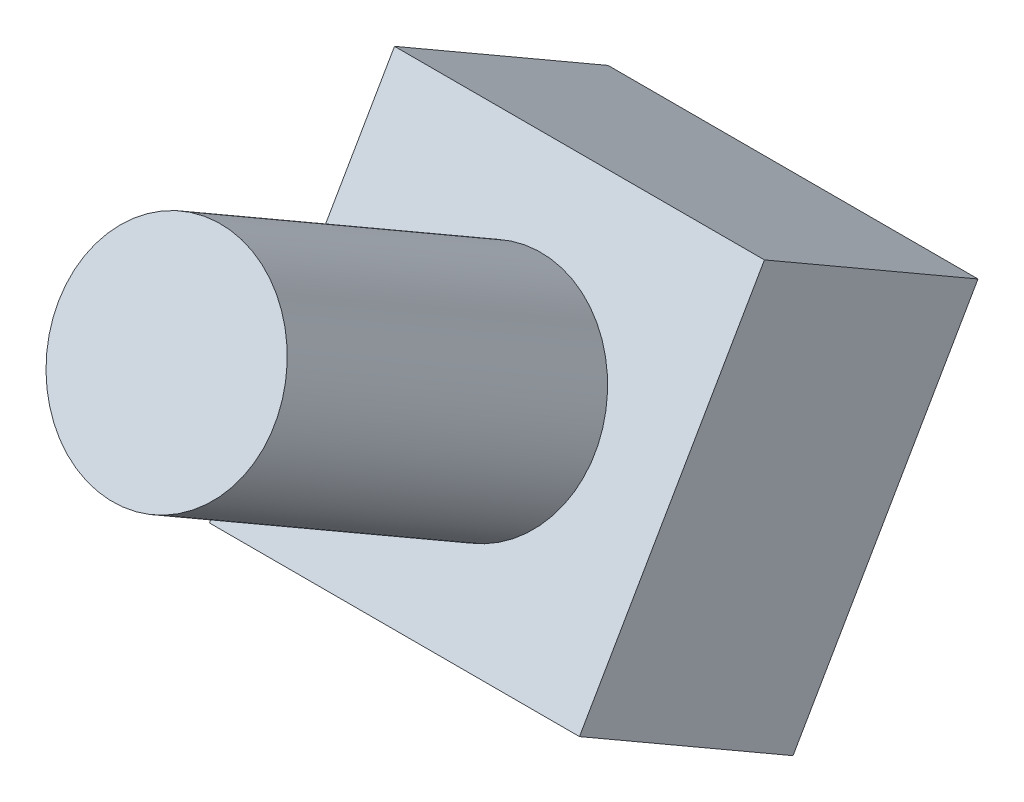
ISO-10303-21;
HEADER;
FILE_DESCRIPTION(('STEP AP214'),'2;1');
FILE_NAME('part.step','',(''),(''),'','','');
FILE_SCHEMA(('AUTOMOTIVE_DESIGN { 1 0 10303 214 1 1 1 1 }'));
ENDSEC;
DATA;
#1=APPLICATION_CONTEXT('core data for automotive mechanical design processes');
#2=APPLICATION_PROTOCOL_DEFINITION('international standard','automotive_design',2000,#1);
#3=PRODUCT_CONTEXT('',#1,'mechanical');
#4=PRODUCT('Part','Part','',(#3));
#5=PRODUCT_RELATED_PRODUCT_CATEGORY('part','',(#4));
#6=PRODUCT_DEFINITION_FORMATION('','',#4);
#7=PRODUCT_DEFINITION_CONTEXT('part definition',#1,'design');
#8=PRODUCT_DEFINITION('design','',#6,#7);
#9=PRODUCT_DEFINITION_SHAPE('','',#8);
#10=(LENGTH_UNIT() NAMED_UNIT(*) SI_UNIT(.MILLI.,.METRE.));
#11=(NAMED_UNIT(*) PLANE_ANGLE_UNIT() SI_UNIT($,.RADIAN.));
#12=(NAMED_UNIT(*) SI_UNIT($,.STERADIAN.) SOLID_ANGLE_UNIT());
#13=UNCERTAINTY_MEASURE_WITH_UNIT(LENGTH_MEASURE(1.E-05),#10,'distance_accuracy_value','');
#14=(GEOMETRIC_REPRESENTATION_CONTEXT(3) GLOBAL_UNCERTAINTY_ASSIGNED_CONTEXT((#13)) GLOBAL_UNIT_ASSIGNED_CONTEXT((#10,
#11,#12)) REPRESENTATION_CONTEXT('',''));
#15=CARTESIAN_POINT('',(0.,0.,0.));
#16=DIRECTION('',(0.,0.,1.));
#17=DIRECTION('',(1.,0.,0.));
#18=AXIS2_PLACEMENT_3D('',#15,#16,#17);
#19=CARTESIAN_POINT('',(93.,23.5934393919997,28.5304445662277));
#20=DIRECTION('',(0.,0.5,0.866025403784439));
#21=DIRECTION('',(1.,0.,0.));
#22=AXIS2_PLACEMENT_3D('',#19,#20,#21);
#23=PLANE('',#22);
#24=CARTESIAN_POINT('',(93.,23.5934393919997,28.5304445662277));
#25=DIRECTION('',(0.,0.5,0.866025403784439));
#26=DIRECTION('',(1.,0.,0.));
#27=AXIS2_PLACEMENT_3D('',#24,#25,#26);
#28=CIRCLE('',#27,1.75);
#29=CARTESIAN_POINT('',(91.25,23.5934393919997,28.5304445662277));
#30=VERTEX_POINT('',#29);
#31=EDGE_CURVE('P0_E21',#30,#30,#28,.T.);
#32=ORIENTED_EDGE('',*,*,#31,.T.);
#33=EDGE_LOOP('',(#32));
#34=FACE_BOUND('',#33,.T.);
#35=ADVANCED_FACE('P0_F17',(#34),#23,.T.);
#36=CARTESIAN_POINT('',(93.,18.5934393919997,19.8701905283833));
#37=DIRECTION('',(0.,0.5,0.866025403784439));
#38=DIRECTION('',(1.,0.,0.));
#39=AXIS2_PLACEMENT_3D('',#36,#37,#38);
#40=CYLINDRICAL_SURFACE('',#39,1.75);
#41=ORIENTED_EDGE('',*,*,#31,.F.);
#42=DIRECTION('',(0.,-0.5,-0.866025403784439));
#43=VECTOR('',#42,1.);
#44=CARTESIAN_POINT('',(91.25,18.5934393919997,19.8701905283833));
#45=LINE('',#44,#43);
#46=CARTESIAN_POINT('',(91.25,20.5934393919997,23.334292143521));
#47=VERTEX_POINT('',#46);
#48=EDGE_CURVE('P0_E11',#30,#47,#45,.T.);
#49=ORIENTED_EDGE('',*,*,#48,.T.);
#50=CARTESIAN_POINT('',(93.,20.5934393919997,23.334292143521));
#51=DIRECTION('',(0.,0.5,0.866025403784439));
#52=DIRECTION('',(1.,0.,0.));
#53=AXIS2_PLACEMENT_3D('',#50,#51,#52);
#54=CIRCLE('',#53,1.75);
#55=EDGE_CURVE('P0_E42',#47,#47,#54,.T.);
#56=ORIENTED_EDGE('',*,*,#55,.T.);
#57=ORIENTED_EDGE('',*,*,#48,.F.);
#58=EDGE_LOOP('',(#41,#49,#56,#57));
#59=FACE_BOUND('',#58,.T.);
#60=ADVANCED_FACE('P0_F19',(#59),#40,.T.);
#61=CARTESIAN_POINT('',(93.,20.322806453317,23.4905421435211));
#62=DIRECTION('',(0.,0.5,0.866025403784439));
#63=DIRECTION('',(1.,0.,0.));
#64=AXIS2_PLACEMENT_3D('',#61,#62,#63);
#65=PLANE('',#64);
#66=ORIENTED_EDGE('',*,*,#55,.F.);
#67=EDGE_LOOP('',(#66));
#68=FACE_BOUND('',#67,.T.);
#69=ADVANCED_FACE('P0_F67',(#68),#65,.F.);
#70=CLOSED_SHELL('',(#35,#60,#69));
#71=MANIFOLD_SOLID_BREP('P0_B1',#70);
#72=CARTESIAN_POINT('',(52.875,29.8442066707183,13.3745570114253));
#73=DIRECTION('',(0.,0.5,0.866025403784439));
#74=DIRECTION('',(1.,0.,0.));
#75=AXIS2_PLACEMENT_3D('',#72,#73,#74);
#76=PLANE('',#75);
#77=DIRECTION('',(0.,0.866025403784439,-0.5));
#78=VECTOR('',#77,1.);
#79=CARTESIAN_POINT('',(90.,26.0629084996405,15.5576905283833));
#80=LINE('',#79,#78);
#81=CARTESIAN_POINT('',(90.,15.9953631806464,21.3701905283833));
#82=VERTEX_POINT('',#81);
#83=CARTESIAN_POINT('',(90.,21.191515603353,18.3701905283833));
#84=VERTEX_POINT('',#83);
#85=EDGE_CURVE('P1_E11',#82,#84,#80,.T.);
#86=ORIENTED_EDGE('',*,*,#85,.T.);
#87=DIRECTION('',(1.,0.,0.));
#88=VECTOR('',#87,1.);
#89=CARTESIAN_POINT('',(74.4375,21.191515603353,18.3701905283833));
#90=LINE('',#89,#88);
#91=CARTESIAN_POINT('',(96.,21.191515603353,18.3701905283833));
#92=VERTEX_POINT('',#91);
#93=EDGE_CURVE('P1_E45',#84,#92,#90,.T.);
#94=ORIENTED_EDGE('',*,*,#93,.T.);
#95=DIRECTION('',(0.,-0.866025403784439,0.5));
#96=VECTOR('',#95,1.);
#97=CARTESIAN_POINT('',(96.,23.4648322882872,17.0576905283833));
#98=LINE('',#97,#96);
#99=CARTESIAN_POINT('',(96.,15.9953631806464,21.3701905283833));
#100=VERTEX_POINT('',#99);
#101=EDGE_CURVE('P1_E68',#92,#100,#98,.T.);
#102=ORIENTED_EDGE('',*,*,#101,.T.);
#103=DIRECTION('',(-1.,0.,0.));
#104=VECTOR('',#103,1.);
#105=CARTESIAN_POINT('',(71.4375,15.9953631806464,21.3701905283833));
#106=LINE('',#105,#104);
#107=EDGE_CURVE('P1_E71',#100,#82,#106,.T.);
#108=ORIENTED_EDGE('',*,*,#107,.T.);
#109=EDGE_LOOP('',(#86,#94,#102,#108));
#110=FACE_BOUND('',#109,.T.);
#111=ADVANCED_FACE('P1_F17',(#110),#76,.F.);
#112=CARTESIAN_POINT('',(90.,21.191515603353,18.3701905283833));
#113=DIRECTION('',(-1.,0.,0.));
#114=DIRECTION('',(0.,0.,1.));
#115=AXIS2_PLACEMENT_3D('',#112,#113,#114);
#116=PLANE('',#115);
#117=ORIENTED_EDGE('',*,*,#85,.F.);
#118=DIRECTION('',(0.,0.5,0.866025403784439));
#119=VECTOR('',#118,1.);
#120=CARTESIAN_POINT('',(90.,15.9953631806464,21.3701905283833));
#121=LINE('',#120,#119);
#122=CARTESIAN_POINT('',(90.,17.9953631806464,24.834292143521));
#123=VERTEX_POINT('',#122);
#124=EDGE_CURVE('P1_E75',#82,#123,#121,.T.);
#125=ORIENTED_EDGE('',*,*,#124,.T.);
#126=DIRECTION('',(0.,-0.866025403784439,0.5));
#127=VECTOR('',#126,1.);
#128=CARTESIAN_POINT('',(90.,17.9953631806464,24.834292143521));
#129=LINE('',#128,#127);
#130=CARTESIAN_POINT('',(90.,23.191515603353,21.834292143521));
#131=VERTEX_POINT('',#130);
#132=EDGE_CURVE('P1_E90',#131,#123,#129,.T.);
#133=ORIENTED_EDGE('',*,*,#132,.F.);
#134=DIRECTION('',(0.,0.5,0.866025403784439));
#135=VECTOR('',#134,1.);
#136=CARTESIAN_POINT('',(90.,21.191515603353,18.3701905283833));
#137=LINE('',#136,#135);
#138=EDGE_CURVE('P1_E26',#84,#131,#137,.T.);
#139=ORIENTED_EDGE('',*,*,#138,.F.);
#140=EDGE_LOOP('',(#117,#125,#133,#139));
#141=FACE_BOUND('',#140,.T.);
#142=ADVANCED_FACE('P1_F158',(#141),#116,.T.);
#143=CARTESIAN_POINT('',(96.,21.191515603353,18.3701905283833));
#144=DIRECTION('',(0.,0.866025403784439,-0.5));
#145=DIRECTION('',(-1.,0.,0.));
#146=AXIS2_PLACEMENT_3D('',#143,#144,#145);
#147=PLANE('',#146);
#148=ORIENTED_EDGE('',*,*,#93,.F.);
#149=ORIENTED_EDGE('',*,*,#138,.T.);
#150=DIRECTION('',(-1.,0.,0.));
#151=VECTOR('',#150,1.);
#152=CARTESIAN_POINT('',(90.,23.191515603353,21.834292143521));
#153=LINE('',#152,#151);
#154=CARTESIAN_POINT('',(96.,23.191515603353,21.834292143521));
#155=VERTEX_POINT('',#154);
#156=EDGE_CURVE('P1_E97',#155,#131,#153,.T.);
#157=ORIENTED_EDGE('',*,*,#156,.F.);
#158=DIRECTION('',(0.,0.5,0.866025403784439));
#159=VECTOR('',#158,1.);
#160=CARTESIAN_POINT('',(96.,21.191515603353,18.3701905283833));
#161=LINE('',#160,#159);
#162=EDGE_CURVE('P1_E74',#92,#155,#161,.T.);
#163=ORIENTED_EDGE('',*,*,#162,.F.);
#164=EDGE_LOOP('',(#148,#149,#157,#163));
#165=FACE_BOUND('',#164,.T.);
#166=ADVANCED_FACE('P1_F163',(#165),#147,.T.);
#167=CARTESIAN_POINT('',(96.,15.9953631806464,21.3701905283833));
#168=DIRECTION('',(1.,0.,0.));
#169=DIRECTION('',(0.,1.,0.));
#170=AXIS2_PLACEMENT_3D('',#167,#168,#169);
#171=PLANE('',#170);
#172=ORIENTED_EDGE('',*,*,#101,.F.);
#173=ORIENTED_EDGE('',*,*,#162,.T.);
#174=DIRECTION('',(0.,0.866025403784439,-0.5));
#175=VECTOR('',#174,1.);
#176=CARTESIAN_POINT('',(96.,23.191515603353,21.834292143521));
#177=LINE('',#176,#175);
#178=CARTESIAN_POINT('',(96.,17.9953631806464,24.834292143521));
#179=VERTEX_POINT('',#178);
#180=EDGE_CURVE('P1_E81',#179,#155,#177,.T.);
#181=ORIENTED_EDGE('',*,*,#180,.F.);
#182=DIRECTION('',(0.,0.5,0.866025403784439));
#183=VECTOR('',#182,1.);
#184=CARTESIAN_POINT('',(96.,15.9953631806464,21.3701905283833));
#185=LINE('',#184,#183);
#186=EDGE_CURVE('P1_E78',#100,#179,#185,.T.);
#187=ORIENTED_EDGE('',*,*,#186,.F.);
#188=EDGE_LOOP('',(#172,#173,#181,#187));
#189=FACE_BOUND('',#188,.T.);
#190=ADVANCED_FACE('P1_F79',(#189),#171,.T.);
#191=CARTESIAN_POINT('',(90.,15.9953631806464,21.3701905283833));
#192=DIRECTION('',(0.,-0.866025403784439,0.5));
#193=DIRECTION('',(-1.,0.,0.));
#194=AXIS2_PLACEMENT_3D('',#191,#192,#193);
#195=PLANE('',#194);
#196=ORIENTED_EDGE('',*,*,#107,.F.);
#197=ORIENTED_EDGE('',*,*,#186,.T.);
#198=DIRECTION('',(1.,0.,0.));
#199=VECTOR('',#198,1.);
#200=CARTESIAN_POINT('',(96.,17.9953631806464,24.834292143521));
#201=LINE('',#200,#199);
#202=EDGE_CURVE('P1_E102',#123,#179,#201,.T.);
#203=ORIENTED_EDGE('',*,*,#202,.F.);
#204=ORIENTED_EDGE('',*,*,#124,.F.);
#205=EDGE_LOOP('',(#196,#197,#203,#204));
#206=FACE_BOUND('',#205,.T.);
#207=ADVANCED_FACE('P1_F88',(#206),#195,.T.);
#208=CARTESIAN_POINT('',(93.,20.5934393919997,23.334292143521));
#209=DIRECTION('',(0.,0.5,0.866025403784439));
#210=DIRECTION('',(1.,0.,0.));
#211=AXIS2_PLACEMENT_3D('',#208,#209,#210);
#212=PLANE('',#211);
#213=ORIENTED_EDGE('',*,*,#202,.T.);
#214=ORIENTED_EDGE('',*,*,#180,.T.);
#215=ORIENTED_EDGE('',*,*,#156,.T.);
#216=ORIENTED_EDGE('',*,*,#132,.T.);
#217=EDGE_LOOP('',(#213,#214,#215,#216));
#218=FACE_BOUND('',#217,.T.);
#219=ADVANCED_FACE('P1_F19',(#218),#212,.T.);
#220=CLOSED_SHELL('',(#111,#142,#166,#190,#207,#219));
#221=MANIFOLD_SOLID_BREP('P1_B1',#220);
#222=ADVANCED_BREP_SHAPE_REPRESENTATION('',(#18,#71,#221),#14);
#223=SHAPE_DEFINITION_REPRESENTATION(#9,#222);
ENDSEC;
END-ISO-10303-21;
